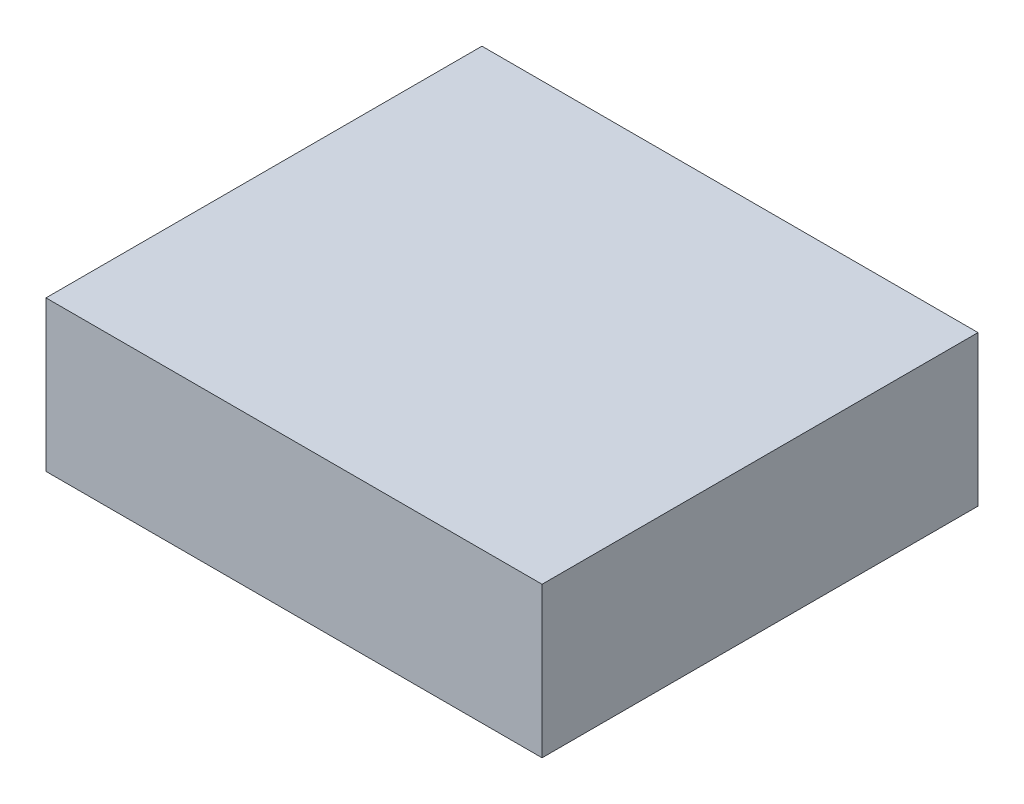
ISO-10303-21;
HEADER;
FILE_DESCRIPTION(('STEP AP214'),'2;1');
FILE_NAME('part.step','',(''),(''),'','','');
FILE_SCHEMA(('AUTOMOTIVE_DESIGN { 1 0 10303 214 1 1 1 1 }'));
ENDSEC;
DATA;
#1=APPLICATION_CONTEXT('core data for automotive mechanical design processes');
#2=APPLICATION_PROTOCOL_DEFINITION('international standard','automotive_design',2000,#1);
#3=PRODUCT_CONTEXT('',#1,'mechanical');
#4=PRODUCT('Part','Part','',(#3));
#5=PRODUCT_RELATED_PRODUCT_CATEGORY('part','',(#4));
#6=PRODUCT_DEFINITION_FORMATION('','',#4);
#7=PRODUCT_DEFINITION_CONTEXT('part definition',#1,'design');
#8=PRODUCT_DEFINITION('design','',#6,#7);
#9=PRODUCT_DEFINITION_SHAPE('','',#8);
#10=(LENGTH_UNIT() NAMED_UNIT(*) SI_UNIT(.MILLI.,.METRE.));
#11=(NAMED_UNIT(*) PLANE_ANGLE_UNIT() SI_UNIT($,.RADIAN.));
#12=(NAMED_UNIT(*) SI_UNIT($,.STERADIAN.) SOLID_ANGLE_UNIT());
#13=UNCERTAINTY_MEASURE_WITH_UNIT(LENGTH_MEASURE(1.E-05),#10,'distance_accuracy_value','');
#14=(GEOMETRIC_REPRESENTATION_CONTEXT(3) GLOBAL_UNCERTAINTY_ASSIGNED_CONTEXT((#13)) GLOBAL_UNIT_ASSIGNED_CONTEXT((#10,
#11,#12)) REPRESENTATION_CONTEXT('',''));
#15=CARTESIAN_POINT('',(0.,0.,0.));
#16=DIRECTION('',(0.,0.,1.));
#17=DIRECTION('',(1.,0.,0.));
#18=AXIS2_PLACEMENT_3D('',#15,#16,#17);
#19=CARTESIAN_POINT('',(16.5,10.,14.5));
#20=DIRECTION('',(-1.,0.,0.));
#21=DIRECTION('',(0.,0.,1.));
#22=AXIS2_PLACEMENT_3D('',#19,#20,#21);
#23=PLANE('',#22);
#24=DIRECTION('',(0.,0.,-1.));
#25=VECTOR('',#24,1.);
#26=CARTESIAN_POINT('',(16.5,0.,14.5));
#27=LINE('',#26,#25);
#28=CARTESIAN_POINT('',(16.5,0.,14.5));
#29=VERTEX_POINT('',#28);
#30=CARTESIAN_POINT('',(16.5,0.,-14.5));
#31=VERTEX_POINT('',#30);
#32=EDGE_CURVE('E102',#29,#31,#27,.T.);
#33=ORIENTED_EDGE('',*,*,#32,.T.);
#34=DIRECTION('',(0.,-1.,0.));
#35=VECTOR('',#34,1.);
#36=CARTESIAN_POINT('',(16.5,10.,-14.5));
#37=LINE('',#36,#35);
#38=CARTESIAN_POINT('',(16.5,10.,-14.5));
#39=VERTEX_POINT('',#38);
#40=EDGE_CURVE('E11',#39,#31,#37,.T.);
#41=ORIENTED_EDGE('',*,*,#40,.F.);
#42=DIRECTION('',(0.,0.,-1.));
#43=VECTOR('',#42,1.);
#44=CARTESIAN_POINT('',(16.5,10.,14.5));
#45=LINE('',#44,#43);
#46=CARTESIAN_POINT('',(16.5,10.,14.5));
#47=VERTEX_POINT('',#46);
#48=EDGE_CURVE('E90',#47,#39,#45,.T.);
#49=ORIENTED_EDGE('',*,*,#48,.F.);
#50=DIRECTION('',(0.,-1.,0.));
#51=VECTOR('',#50,1.);
#52=CARTESIAN_POINT('',(16.5,10.,14.5));
#53=LINE('',#52,#51);
#54=EDGE_CURVE('E98',#47,#29,#53,.T.);
#55=ORIENTED_EDGE('',*,*,#54,.T.);
#56=EDGE_LOOP('',(#33,#41,#49,#55));
#57=FACE_BOUND('',#56,.T.);
#58=ADVANCED_FACE('F39',(#57),#23,.F.);
#59=CARTESIAN_POINT('',(-16.5,10.,-14.5));
#60=DIRECTION('',(0.,0.,1.));
#61=DIRECTION('',(1.,0.,0.));
#62=AXIS2_PLACEMENT_3D('',#59,#60,#61);
#63=PLANE('',#62);
#64=DIRECTION('',(-1.,0.,0.));
#65=VECTOR('',#64,1.);
#66=CARTESIAN_POINT('',(-16.5,0.,-14.5));
#67=LINE('',#66,#65);
#68=CARTESIAN_POINT('',(-16.5,0.,-14.5));
#69=VERTEX_POINT('',#68);
#70=EDGE_CURVE('E94',#31,#69,#67,.T.);
#71=ORIENTED_EDGE('',*,*,#70,.T.);
#72=DIRECTION('',(0.,-1.,0.));
#73=VECTOR('',#72,1.);
#74=CARTESIAN_POINT('',(-16.5,10.,-14.5));
#75=LINE('',#74,#73);
#76=CARTESIAN_POINT('',(-16.5,10.,-14.5));
#77=VERTEX_POINT('',#76);
#78=EDGE_CURVE('E47',#77,#69,#75,.T.);
#79=ORIENTED_EDGE('',*,*,#78,.F.);
#80=DIRECTION('',(-1.,0.,0.));
#81=VECTOR('',#80,1.);
#82=CARTESIAN_POINT('',(-16.5,10.,-14.5));
#83=LINE('',#82,#81);
#84=EDGE_CURVE('E85',#39,#77,#83,.T.);
#85=ORIENTED_EDGE('',*,*,#84,.F.);
#86=ORIENTED_EDGE('',*,*,#40,.T.);
#87=EDGE_LOOP('',(#71,#79,#85,#86));
#88=FACE_BOUND('',#87,.T.);
#89=ADVANCED_FACE('F93',(#88),#63,.F.);
#90=CARTESIAN_POINT('',(-16.5,10.,14.5));
#91=DIRECTION('',(1.,0.,0.));
#92=DIRECTION('',(0.,0.,-1.));
#93=AXIS2_PLACEMENT_3D('',#90,#91,#92);
#94=PLANE('',#93);
#95=DIRECTION('',(0.,0.,1.));
#96=VECTOR('',#95,1.);
#97=CARTESIAN_POINT('',(-16.5,0.,14.5));
#98=LINE('',#97,#96);
#99=CARTESIAN_POINT('',(-16.5,0.,14.5));
#100=VERTEX_POINT('',#99);
#101=EDGE_CURVE('E72',#69,#100,#98,.T.);
#102=ORIENTED_EDGE('',*,*,#101,.T.);
#103=DIRECTION('',(0.,-1.,0.));
#104=VECTOR('',#103,1.);
#105=CARTESIAN_POINT('',(-16.5,10.,14.5));
#106=LINE('',#105,#104);
#107=CARTESIAN_POINT('',(-16.5,10.,14.5));
#108=VERTEX_POINT('',#107);
#109=EDGE_CURVE('E95',#108,#100,#106,.T.);
#110=ORIENTED_EDGE('',*,*,#109,.F.);
#111=DIRECTION('',(0.,0.,1.));
#112=VECTOR('',#111,1.);
#113=CARTESIAN_POINT('',(-16.5,10.,14.5));
#114=LINE('',#113,#112);
#115=EDGE_CURVE('E88',#77,#108,#114,.T.);
#116=ORIENTED_EDGE('',*,*,#115,.F.);
#117=ORIENTED_EDGE('',*,*,#78,.T.);
#118=EDGE_LOOP('',(#102,#110,#116,#117));
#119=FACE_BOUND('',#118,.T.);
#120=ADVANCED_FACE('F96',(#119),#94,.F.);
#121=CARTESIAN_POINT('',(-16.5,10.,14.5));
#122=DIRECTION('',(0.,0.,-1.));
#123=DIRECTION('',(-1.,0.,0.));
#124=AXIS2_PLACEMENT_3D('',#121,#122,#123);
#125=PLANE('',#124);
#126=DIRECTION('',(1.,0.,0.));
#127=VECTOR('',#126,1.);
#128=CARTESIAN_POINT('',(-16.5,0.,14.5));
#129=LINE('',#128,#127);
#130=EDGE_CURVE('E78',#100,#29,#129,.T.);
#131=ORIENTED_EDGE('',*,*,#130,.T.);
#132=ORIENTED_EDGE('',*,*,#54,.F.);
#133=DIRECTION('',(1.,0.,0.));
#134=VECTOR('',#133,1.);
#135=CARTESIAN_POINT('',(-16.5,10.,14.5));
#136=LINE('',#135,#134);
#137=EDGE_CURVE('E55',#108,#47,#136,.T.);
#138=ORIENTED_EDGE('',*,*,#137,.F.);
#139=ORIENTED_EDGE('',*,*,#109,.T.);
#140=EDGE_LOOP('',(#131,#132,#138,#139));
#141=FACE_BOUND('',#140,.T.);
#142=ADVANCED_FACE('F109',(#141),#125,.F.);
#143=CARTESIAN_POINT('',(0.,10.,0.));
#144=DIRECTION('',(0.,-1.,0.));
#145=DIRECTION('',(0.,0.,-1.));
#146=AXIS2_PLACEMENT_3D('',#143,#144,#145);
#147=PLANE('',#146);
#148=ORIENTED_EDGE('',*,*,#48,.T.);
#149=ORIENTED_EDGE('',*,*,#84,.T.);
#150=ORIENTED_EDGE('',*,*,#115,.T.);
#151=ORIENTED_EDGE('',*,*,#137,.T.);
#152=EDGE_LOOP('',(#148,#149,#150,#151));
#153=FACE_BOUND('',#152,.T.);
#154=ADVANCED_FACE('F86',(#153),#147,.F.);
#155=CARTESIAN_POINT('',(0.,0.,0.));
#156=DIRECTION('',(0.,-1.,0.));
#157=DIRECTION('',(0.,0.,-1.));
#158=AXIS2_PLACEMENT_3D('',#155,#156,#157);
#159=PLANE('',#158);
#160=ORIENTED_EDGE('',*,*,#32,.F.);
#161=ORIENTED_EDGE('',*,*,#130,.F.);
#162=ORIENTED_EDGE('',*,*,#101,.F.);
#163=ORIENTED_EDGE('',*,*,#70,.F.);
#164=EDGE_LOOP('',(#160,#161,#162,#163));
#165=FACE_BOUND('',#164,.T.);
#166=ADVANCED_FACE('F112',(#165),#159,.T.);
#167=CLOSED_SHELL('',(#58,#89,#120,#142,#154,#166));
#168=MANIFOLD_SOLID_BREP('B2',#167);
#169=ADVANCED_BREP_SHAPE_REPRESENTATION('',(#18,#168),#14);
#170=SHAPE_DEFINITION_REPRESENTATION(#9,#169);
ENDSEC;
END-ISO-10303-21;
